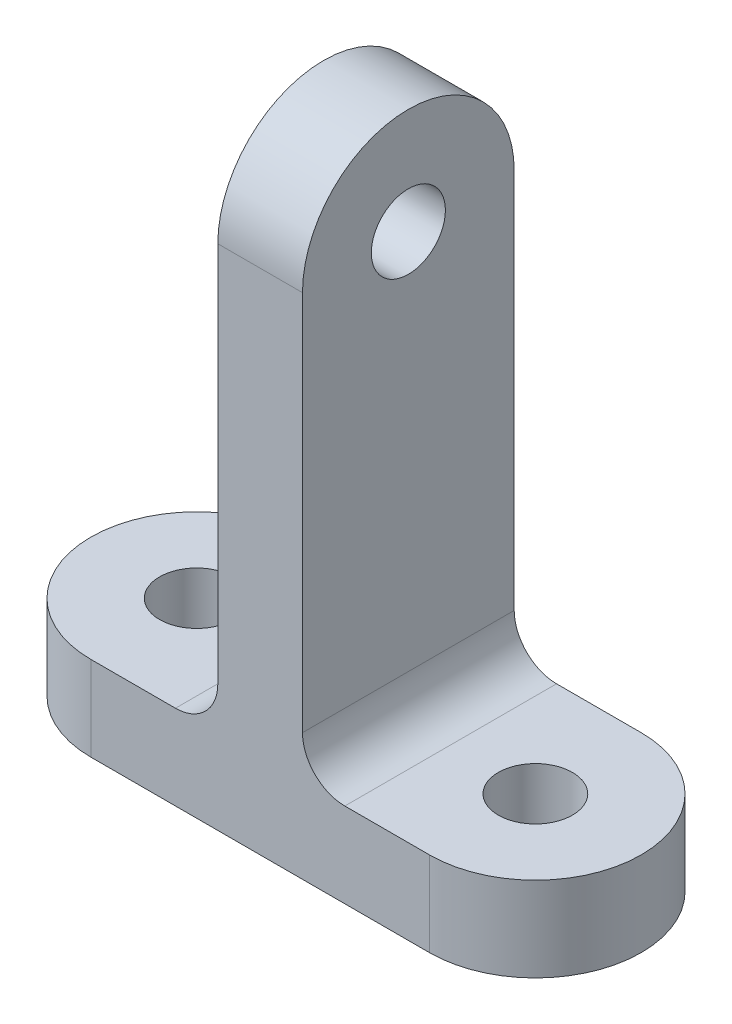
ISO-10303-21;
HEADER;
FILE_DESCRIPTION(('STEP AP214'),'2;1');
FILE_NAME('part.step','',(''),(''),'','','');
FILE_SCHEMA(('AUTOMOTIVE_DESIGN { 1 0 10303 214 1 1 1 1 }'));
ENDSEC;
DATA;
#1=APPLICATION_CONTEXT('core data for automotive mechanical design processes');
#2=APPLICATION_PROTOCOL_DEFINITION('international standard','automotive_design',2000,#1);
#3=PRODUCT_CONTEXT('',#1,'mechanical');
#4=PRODUCT('Part','Part','',(#3));
#5=PRODUCT_RELATED_PRODUCT_CATEGORY('part','',(#4));
#6=PRODUCT_DEFINITION_FORMATION('','',#4);
#7=PRODUCT_DEFINITION_CONTEXT('part definition',#1,'design');
#8=PRODUCT_DEFINITION('design','',#6,#7);
#9=PRODUCT_DEFINITION_SHAPE('','',#8);
#10=(LENGTH_UNIT() NAMED_UNIT(*) SI_UNIT(.MILLI.,.METRE.));
#11=(NAMED_UNIT(*) PLANE_ANGLE_UNIT() SI_UNIT($,.RADIAN.));
#12=(NAMED_UNIT(*) SI_UNIT($,.STERADIAN.) SOLID_ANGLE_UNIT());
#13=UNCERTAINTY_MEASURE_WITH_UNIT(LENGTH_MEASURE(1.E-05),#10,'distance_accuracy_value','');
#14=(GEOMETRIC_REPRESENTATION_CONTEXT(3) GLOBAL_UNCERTAINTY_ASSIGNED_CONTEXT((#13)) GLOBAL_UNIT_ASSIGNED_CONTEXT((#10,
#11,#12)) REPRESENTATION_CONTEXT('',''));
#15=CARTESIAN_POINT('',(0.,0.,0.));
#16=DIRECTION('',(0.,0.,1.));
#17=DIRECTION('',(1.,0.,0.));
#18=AXIS2_PLACEMENT_3D('',#15,#16,#17);
#19=CARTESIAN_POINT('',(-2.,29.,-5.));
#20=DIRECTION('',(1.,0.,0.));
#21=DIRECTION('',(0.,0.,-1.));
#22=AXIS2_PLACEMENT_3D('',#19,#20,#21);
#23=PLANE('',#22);
#24=CARTESIAN_POINT('',(-2.,24.,0.));
#25=DIRECTION('',(1.,0.,0.));
#26=DIRECTION('',(0.,0.,-1.));
#27=AXIS2_PLACEMENT_3D('',#24,#25,#26);
#28=CIRCLE('',#27,1.75);
#29=CARTESIAN_POINT('',(-2.,24.,-1.75));
#30=VERTEX_POINT('',#29);
#31=EDGE_CURVE('E153',#30,#30,#28,.F.);
#32=ORIENTED_EDGE('',*,*,#31,.F.);
#33=EDGE_LOOP('',(#32));
#34=FACE_BOUND('',#33,.T.);
#35=DIRECTION('',(0.,-1.,0.));
#36=VECTOR('',#35,1.);
#37=CARTESIAN_POINT('',(-2.,29.,-5.));
#38=LINE('',#37,#36);
#39=CARTESIAN_POINT('',(-2.,24.,-5.));
#40=VERTEX_POINT('',#39);
#41=CARTESIAN_POINT('',(-2.,6.,-5.));
#42=VERTEX_POINT('',#41);
#43=EDGE_CURVE('E152',#40,#42,#38,.T.);
#44=ORIENTED_EDGE('',*,*,#43,.T.);
#45=DIRECTION('',(0.,0.,1.));
#46=VECTOR('',#45,1.);
#47=CARTESIAN_POINT('',(-2.,6.,-5.));
#48=LINE('',#47,#46);
#49=CARTESIAN_POINT('',(-2.,6.,5.));
#50=VERTEX_POINT('',#49);
#51=EDGE_CURVE('E220',#42,#50,#48,.T.);
#52=ORIENTED_EDGE('',*,*,#51,.T.);
#53=DIRECTION('',(0.,-1.,0.));
#54=VECTOR('',#53,1.);
#55=CARTESIAN_POINT('',(-2.,29.,5.));
#56=LINE('',#55,#54);
#57=CARTESIAN_POINT('',(-2.,24.,5.));
#58=VERTEX_POINT('',#57);
#59=EDGE_CURVE('E161',#58,#50,#56,.T.);
#60=ORIENTED_EDGE('',*,*,#59,.F.);
#61=CARTESIAN_POINT('',(-2.,24.,0.));
#62=DIRECTION('',(1.,0.,0.));
#63=DIRECTION('',(0.,0.,-1.));
#64=AXIS2_PLACEMENT_3D('',#61,#62,#63);
#65=CIRCLE('',#64,5.);
#66=EDGE_CURVE('E163',#58,#40,#65,.F.);
#67=ORIENTED_EDGE('',*,*,#66,.T.);
#68=EDGE_LOOP('',(#44,#52,#60,#67));
#69=FACE_BOUND('',#68,.T.);
#70=ADVANCED_FACE('F59',(#34,#69),#23,.F.);
#71=CARTESIAN_POINT('',(2.,29.,-5.));
#72=DIRECTION('',(-1.,0.,0.));
#73=DIRECTION('',(0.,0.,1.));
#74=AXIS2_PLACEMENT_3D('',#71,#72,#73);
#75=PLANE('',#74);
#76=CARTESIAN_POINT('',(2.,24.,0.));
#77=DIRECTION('',(1.,0.,0.));
#78=DIRECTION('',(0.,0.,-1.));
#79=AXIS2_PLACEMENT_3D('',#76,#77,#78);
#80=CIRCLE('',#79,1.75);
#81=CARTESIAN_POINT('',(2.,24.,-1.75));
#82=VERTEX_POINT('',#81);
#83=EDGE_CURVE('E233',#82,#82,#80,.T.);
#84=ORIENTED_EDGE('',*,*,#83,.F.);
#85=EDGE_LOOP('',(#84));
#86=FACE_BOUND('',#85,.T.);
#87=DIRECTION('',(0.,-1.,0.));
#88=VECTOR('',#87,1.);
#89=CARTESIAN_POINT('',(2.,29.,5.));
#90=LINE('',#89,#88);
#91=CARTESIAN_POINT('',(2.,24.,5.));
#92=VERTEX_POINT('',#91);
#93=CARTESIAN_POINT('',(2.,6.,5.));
#94=VERTEX_POINT('',#93);
#95=EDGE_CURVE('E159',#92,#94,#90,.T.);
#96=ORIENTED_EDGE('',*,*,#95,.T.);
#97=DIRECTION('',(0.,0.,-1.));
#98=VECTOR('',#97,1.);
#99=CARTESIAN_POINT('',(2.,6.,-5.));
#100=LINE('',#99,#98);
#101=CARTESIAN_POINT('',(2.,6.,-5.));
#102=VERTEX_POINT('',#101);
#103=EDGE_CURVE('E158',#94,#102,#100,.T.);
#104=ORIENTED_EDGE('',*,*,#103,.T.);
#105=DIRECTION('',(0.,-1.,0.));
#106=VECTOR('',#105,1.);
#107=CARTESIAN_POINT('',(2.,29.,-5.));
#108=LINE('',#107,#106);
#109=CARTESIAN_POINT('',(2.,24.,-5.));
#110=VERTEX_POINT('',#109);
#111=EDGE_CURVE('E150',#110,#102,#108,.T.);
#112=ORIENTED_EDGE('',*,*,#111,.F.);
#113=CARTESIAN_POINT('',(2.,24.,0.));
#114=DIRECTION('',(1.,0.,0.));
#115=DIRECTION('',(0.,0.,-1.));
#116=AXIS2_PLACEMENT_3D('',#113,#114,#115);
#117=CIRCLE('',#116,5.);
#118=EDGE_CURVE('E135',#110,#92,#117,.T.);
#119=ORIENTED_EDGE('',*,*,#118,.T.);
#120=EDGE_LOOP('',(#96,#104,#112,#119));
#121=FACE_BOUND('',#120,.T.);
#122=ADVANCED_FACE('F156',(#86,#121),#75,.F.);
#123=CARTESIAN_POINT('',(0.,4.,-5.));
#124=DIRECTION('',(0.,0.,-1.));
#125=DIRECTION('',(-1.,0.,0.));
#126=AXIS2_PLACEMENT_3D('',#123,#124,#125);
#127=PLANE('',#126);
#128=ORIENTED_EDGE('',*,*,#43,.F.);
#129=DIRECTION('',(1.,0.,0.));
#130=VECTOR('',#129,1.);
#131=CARTESIAN_POINT('',(-9.07106781186547,24.,-5.));
#132=LINE('',#131,#130);
#133=EDGE_CURVE('E138',#40,#110,#132,.T.);
#134=ORIENTED_EDGE('',*,*,#133,.T.);
#135=ORIENTED_EDGE('',*,*,#111,.T.);
#136=CARTESIAN_POINT('',(4.,6.,-5.));
#137=DIRECTION('',(0.,0.,-1.));
#138=DIRECTION('',(-1.,0.,0.));
#139=AXIS2_PLACEMENT_3D('',#136,#137,#138);
#140=CIRCLE('',#139,2.);
#141=CARTESIAN_POINT('',(4.,4.,-5.));
#142=VERTEX_POINT('',#141);
#143=EDGE_CURVE('E216',#102,#142,#140,.F.);
#144=ORIENTED_EDGE('',*,*,#143,.T.);
#145=DIRECTION('',(1.,0.,0.));
#146=VECTOR('',#145,1.);
#147=CARTESIAN_POINT('',(0.,4.,-5.));
#148=LINE('',#147,#146);
#149=CARTESIAN_POINT('',(8.,4.,-5.));
#150=VERTEX_POINT('',#149);
#151=EDGE_CURVE('E183',#142,#150,#148,.T.);
#152=ORIENTED_EDGE('',*,*,#151,.T.);
#153=DIRECTION('',(0.,-1.,0.));
#154=VECTOR('',#153,1.);
#155=CARTESIAN_POINT('',(8.,4.,-5.));
#156=LINE('',#155,#154);
#157=CARTESIAN_POINT('',(8.,0.,-5.));
#158=VERTEX_POINT('',#157);
#159=EDGE_CURVE('E207',#150,#158,#156,.T.);
#160=ORIENTED_EDGE('',*,*,#159,.T.);
#161=DIRECTION('',(1.,0.,0.));
#162=VECTOR('',#161,1.);
#163=CARTESIAN_POINT('',(0.,0.,-5.));
#164=LINE('',#163,#162);
#165=CARTESIAN_POINT('',(-8.,0.,-5.));
#166=VERTEX_POINT('',#165);
#167=EDGE_CURVE('E201',#166,#158,#164,.T.);
#168=ORIENTED_EDGE('',*,*,#167,.F.);
#169=DIRECTION('',(0.,-1.,0.));
#170=VECTOR('',#169,1.);
#171=CARTESIAN_POINT('',(-8.,4.,-5.));
#172=LINE('',#171,#170);
#173=CARTESIAN_POINT('',(-8.,4.,-5.));
#174=VERTEX_POINT('',#173);
#175=EDGE_CURVE('E189',#174,#166,#172,.T.);
#176=ORIENTED_EDGE('',*,*,#175,.F.);
#177=CARTESIAN_POINT('',(-4.,4.,-5.));
#178=VERTEX_POINT('',#177);
#179=EDGE_CURVE('E184',#174,#178,#148,.T.);
#180=ORIENTED_EDGE('',*,*,#179,.T.);
#181=CARTESIAN_POINT('',(-4.,6.,-5.));
#182=DIRECTION('',(0.,0.,-1.));
#183=DIRECTION('',(-1.,0.,0.));
#184=AXIS2_PLACEMENT_3D('',#181,#182,#183);
#185=CIRCLE('',#184,2.);
#186=EDGE_CURVE('E12',#178,#42,#185,.F.);
#187=ORIENTED_EDGE('',*,*,#186,.T.);
#188=EDGE_LOOP('',(#128,#134,#135,#144,#152,#160,#168,#176,#180,#187));
#189=FACE_BOUND('',#188,.T.);
#190=ADVANCED_FACE('F149',(#189),#127,.T.);
#191=CARTESIAN_POINT('',(0.,4.,0.));
#192=DIRECTION('',(0.,1.,0.));
#193=DIRECTION('',(0.,0.,1.));
#194=AXIS2_PLACEMENT_3D('',#191,#192,#193);
#195=PLANE('',#194);
#196=DIRECTION('',(-1.,0.,0.));
#197=VECTOR('',#196,1.);
#198=CARTESIAN_POINT('',(0.,4.,5.));
#199=LINE('',#198,#197);
#200=CARTESIAN_POINT('',(-4.,4.,5.));
#201=VERTEX_POINT('',#200);
#202=CARTESIAN_POINT('',(-8.,4.,5.));
#203=VERTEX_POINT('',#202);
#204=EDGE_CURVE('E176',#201,#203,#199,.T.);
#205=ORIENTED_EDGE('',*,*,#204,.F.);
#206=DIRECTION('',(0.,0.,1.));
#207=VECTOR('',#206,1.);
#208=CARTESIAN_POINT('',(-4.,4.,0.));
#209=LINE('',#208,#207);
#210=EDGE_CURVE('E80',#201,#178,#209,.F.);
#211=ORIENTED_EDGE('',*,*,#210,.T.);
#212=ORIENTED_EDGE('',*,*,#179,.F.);
#213=CARTESIAN_POINT('',(-8.,4.,0.));
#214=DIRECTION('',(0.,1.,0.));
#215=DIRECTION('',(0.,0.,1.));
#216=AXIS2_PLACEMENT_3D('',#213,#214,#215);
#217=CIRCLE('',#216,5.);
#218=EDGE_CURVE('E172',#174,#203,#217,.T.);
#219=ORIENTED_EDGE('',*,*,#218,.T.);
#220=EDGE_LOOP('',(#205,#211,#212,#219));
#221=FACE_BOUND('',#220,.T.);
#222=CARTESIAN_POINT('',(-8.,4.,0.));
#223=DIRECTION('',(0.,1.,0.));
#224=DIRECTION('',(0.,0.,1.));
#225=AXIS2_PLACEMENT_3D('',#222,#223,#224);
#226=CIRCLE('',#225,1.75);
#227=CARTESIAN_POINT('',(-8.,4.,1.75));
#228=VERTEX_POINT('',#227);
#229=EDGE_CURVE('E169',#228,#228,#226,.T.);
#230=ORIENTED_EDGE('',*,*,#229,.F.);
#231=EDGE_LOOP('',(#230));
#232=FACE_BOUND('',#231,.T.);
#233=ADVANCED_FACE('F245',(#221,#232),#195,.T.);
#234=CARTESIAN_POINT('',(-8.,4.,0.));
#235=DIRECTION('',(0.,-1.,0.));
#236=DIRECTION('',(0.,0.,-1.));
#237=AXIS2_PLACEMENT_3D('',#234,#235,#236);
#238=CYLINDRICAL_SURFACE('',#237,5.);
#239=CARTESIAN_POINT('',(-8.,0.,0.));
#240=DIRECTION('',(0.,1.,0.));
#241=DIRECTION('',(0.,0.,1.));
#242=AXIS2_PLACEMENT_3D('',#239,#240,#241);
#243=CIRCLE('',#242,5.);
#244=CARTESIAN_POINT('',(-8.,0.,5.));
#245=VERTEX_POINT('',#244);
#246=EDGE_CURVE('E192',#166,#245,#243,.T.);
#247=ORIENTED_EDGE('',*,*,#246,.T.);
#248=DIRECTION('',(0.,-1.,0.));
#249=VECTOR('',#248,1.);
#250=CARTESIAN_POINT('',(-8.,4.,5.));
#251=LINE('',#250,#249);
#252=EDGE_CURVE('E211',#203,#245,#251,.T.);
#253=ORIENTED_EDGE('',*,*,#252,.F.);
#254=ORIENTED_EDGE('',*,*,#218,.F.);
#255=ORIENTED_EDGE('',*,*,#175,.T.);
#256=EDGE_LOOP('',(#247,#253,#254,#255));
#257=FACE_BOUND('',#256,.T.);
#258=ADVANCED_FACE('F271',(#257),#238,.T.);
#259=CARTESIAN_POINT('',(0.,4.,5.));
#260=DIRECTION('',(0.,0.,1.));
#261=DIRECTION('',(1.,0.,0.));
#262=AXIS2_PLACEMENT_3D('',#259,#260,#261);
#263=PLANE('',#262);
#264=DIRECTION('',(1.,0.,0.));
#265=VECTOR('',#264,1.);
#266=CARTESIAN_POINT('',(-9.07106781186547,24.,5.));
#267=LINE('',#266,#265);
#268=EDGE_CURVE('E141',#58,#92,#267,.T.);
#269=ORIENTED_EDGE('',*,*,#268,.F.);
#270=ORIENTED_EDGE('',*,*,#59,.T.);
#271=CARTESIAN_POINT('',(-4.,6.,5.));
#272=DIRECTION('',(0.,0.,1.));
#273=DIRECTION('',(1.,0.,0.));
#274=AXIS2_PLACEMENT_3D('',#271,#272,#273);
#275=CIRCLE('',#274,2.);
#276=EDGE_CURVE('E67',#50,#201,#275,.F.);
#277=ORIENTED_EDGE('',*,*,#276,.T.);
#278=ORIENTED_EDGE('',*,*,#204,.T.);
#279=ORIENTED_EDGE('',*,*,#252,.T.);
#280=DIRECTION('',(-1.,0.,0.));
#281=VECTOR('',#280,1.);
#282=CARTESIAN_POINT('',(0.,0.,5.));
#283=LINE('',#282,#281);
#284=CARTESIAN_POINT('',(8.,0.,5.));
#285=VERTEX_POINT('',#284);
#286=EDGE_CURVE('E195',#285,#245,#283,.T.);
#287=ORIENTED_EDGE('',*,*,#286,.F.);
#288=DIRECTION('',(0.,-1.,0.));
#289=VECTOR('',#288,1.);
#290=CARTESIAN_POINT('',(8.,4.,5.));
#291=LINE('',#290,#289);
#292=CARTESIAN_POINT('',(8.,4.,5.));
#293=VERTEX_POINT('',#292);
#294=EDGE_CURVE('E209',#293,#285,#291,.T.);
#295=ORIENTED_EDGE('',*,*,#294,.F.);
#296=CARTESIAN_POINT('',(4.,4.,5.));
#297=VERTEX_POINT('',#296);
#298=EDGE_CURVE('E177',#293,#297,#199,.T.);
#299=ORIENTED_EDGE('',*,*,#298,.T.);
#300=CARTESIAN_POINT('',(4.,6.,5.));
#301=DIRECTION('',(0.,0.,1.));
#302=DIRECTION('',(1.,0.,0.));
#303=AXIS2_PLACEMENT_3D('',#300,#301,#302);
#304=CIRCLE('',#303,2.);
#305=EDGE_CURVE('E218',#297,#94,#304,.F.);
#306=ORIENTED_EDGE('',*,*,#305,.T.);
#307=ORIENTED_EDGE('',*,*,#95,.F.);
#308=EDGE_LOOP('',(#269,#270,#277,#278,#279,#287,#295,#299,#306,#307));
#309=FACE_BOUND('',#308,.T.);
#310=ADVANCED_FACE('F228',(#309),#263,.T.);
#311=CARTESIAN_POINT('',(8.,4.,0.));
#312=DIRECTION('',(0.,-1.,0.));
#313=DIRECTION('',(0.,0.,-1.));
#314=AXIS2_PLACEMENT_3D('',#311,#312,#313);
#315=CYLINDRICAL_SURFACE('',#314,5.);
#316=CARTESIAN_POINT('',(8.,0.,0.));
#317=DIRECTION('',(0.,1.,0.));
#318=DIRECTION('',(0.,0.,1.));
#319=AXIS2_PLACEMENT_3D('',#316,#317,#318);
#320=CIRCLE('',#319,5.);
#321=EDGE_CURVE('E198',#285,#158,#320,.T.);
#322=ORIENTED_EDGE('',*,*,#321,.T.);
#323=ORIENTED_EDGE('',*,*,#159,.F.);
#324=CARTESIAN_POINT('',(8.,4.,0.));
#325=DIRECTION('',(0.,1.,0.));
#326=DIRECTION('',(0.,0.,1.));
#327=AXIS2_PLACEMENT_3D('',#324,#325,#326);
#328=CIRCLE('',#327,5.);
#329=EDGE_CURVE('E180',#293,#150,#328,.T.);
#330=ORIENTED_EDGE('',*,*,#329,.F.);
#331=ORIENTED_EDGE('',*,*,#294,.T.);
#332=EDGE_LOOP('',(#322,#323,#330,#331));
#333=FACE_BOUND('',#332,.T.);
#334=ADVANCED_FACE('F265',(#333),#315,.T.);
#335=CARTESIAN_POINT('',(-8.,4.,0.));
#336=DIRECTION('',(0.,-1.,0.));
#337=DIRECTION('',(0.,0.,-1.));
#338=AXIS2_PLACEMENT_3D('',#335,#336,#337);
#339=CYLINDRICAL_SURFACE('',#338,1.75);
#340=ORIENTED_EDGE('',*,*,#229,.T.);
#341=EDGE_LOOP('',(#340));
#342=FACE_BOUND('',#341,.T.);
#343=CARTESIAN_POINT('',(-8.,0.,0.));
#344=DIRECTION('',(0.,1.,0.));
#345=DIRECTION('',(0.,0.,1.));
#346=AXIS2_PLACEMENT_3D('',#343,#344,#345);
#347=CIRCLE('',#346,1.75);
#348=CARTESIAN_POINT('',(-8.,0.,1.75));
#349=VERTEX_POINT('',#348);
#350=EDGE_CURVE('E168',#349,#349,#347,.T.);
#351=ORIENTED_EDGE('',*,*,#350,.F.);
#352=EDGE_LOOP('',(#351));
#353=FACE_BOUND('',#352,.T.);
#354=ADVANCED_FACE('F262',(#342,#353),#339,.F.);
#355=CARTESIAN_POINT('',(8.,4.,0.));
#356=DIRECTION('',(0.,-1.,0.));
#357=DIRECTION('',(0.,0.,-1.));
#358=AXIS2_PLACEMENT_3D('',#355,#356,#357);
#359=CYLINDRICAL_SURFACE('',#358,1.75);
#360=CARTESIAN_POINT('',(8.,4.,0.));
#361=DIRECTION('',(0.,1.,0.));
#362=DIRECTION('',(0.,0.,1.));
#363=AXIS2_PLACEMENT_3D('',#360,#361,#362);
#364=CIRCLE('',#363,1.75);
#365=CARTESIAN_POINT('',(8.,4.,1.75));
#366=VERTEX_POINT('',#365);
#367=EDGE_CURVE('E186',#366,#366,#364,.T.);
#368=ORIENTED_EDGE('',*,*,#367,.T.);
#369=EDGE_LOOP('',(#368));
#370=FACE_BOUND('',#369,.T.);
#371=CARTESIAN_POINT('',(8.,0.,0.));
#372=DIRECTION('',(0.,1.,0.));
#373=DIRECTION('',(0.,0.,1.));
#374=AXIS2_PLACEMENT_3D('',#371,#372,#373);
#375=CIRCLE('',#374,1.75);
#376=CARTESIAN_POINT('',(8.,0.,1.75));
#377=VERTEX_POINT('',#376);
#378=EDGE_CURVE('E173',#377,#377,#375,.T.);
#379=ORIENTED_EDGE('',*,*,#378,.F.);
#380=EDGE_LOOP('',(#379));
#381=FACE_BOUND('',#380,.T.);
#382=ADVANCED_FACE('F256',(#370,#381),#359,.F.);
#383=ORIENTED_EDGE('',*,*,#151,.F.);
#384=DIRECTION('',(0.,0.,-1.));
#385=VECTOR('',#384,1.);
#386=CARTESIAN_POINT('',(4.,4.,0.));
#387=LINE('',#386,#385);
#388=EDGE_CURVE('E214',#142,#297,#387,.F.);
#389=ORIENTED_EDGE('',*,*,#388,.T.);
#390=ORIENTED_EDGE('',*,*,#298,.F.);
#391=ORIENTED_EDGE('',*,*,#329,.T.);
#392=EDGE_LOOP('',(#383,#389,#390,#391));
#393=FACE_BOUND('',#392,.T.);
#394=ORIENTED_EDGE('',*,*,#367,.F.);
#395=EDGE_LOOP('',(#394));
#396=FACE_BOUND('',#395,.T.);
#397=ADVANCED_FACE('F252',(#393,#396),#195,.T.);
#398=CARTESIAN_POINT('',(0.,0.,0.));
#399=DIRECTION('',(0.,1.,0.));
#400=DIRECTION('',(0.,0.,1.));
#401=AXIS2_PLACEMENT_3D('',#398,#399,#400);
#402=PLANE('',#401);
#403=ORIENTED_EDGE('',*,*,#350,.T.);
#404=EDGE_LOOP('',(#403));
#405=FACE_BOUND('',#404,.T.);
#406=ORIENTED_EDGE('',*,*,#246,.F.);
#407=ORIENTED_EDGE('',*,*,#167,.T.);
#408=ORIENTED_EDGE('',*,*,#321,.F.);
#409=ORIENTED_EDGE('',*,*,#286,.T.);
#410=EDGE_LOOP('',(#406,#407,#408,#409));
#411=FACE_BOUND('',#410,.T.);
#412=ORIENTED_EDGE('',*,*,#378,.T.);
#413=EDGE_LOOP('',(#412));
#414=FACE_BOUND('',#413,.T.);
#415=ADVANCED_FACE('F255',(#405,#411,#414),#402,.F.);
#416=CARTESIAN_POINT('',(-9.07106781186547,24.,0.));
#417=DIRECTION('',(1.,0.,0.));
#418=DIRECTION('',(0.,0.,-1.));
#419=AXIS2_PLACEMENT_3D('',#416,#417,#418);
#420=CYLINDRICAL_SURFACE('',#419,5.);
#421=ORIENTED_EDGE('',*,*,#268,.T.);
#422=ORIENTED_EDGE('',*,*,#118,.F.);
#423=ORIENTED_EDGE('',*,*,#133,.F.);
#424=ORIENTED_EDGE('',*,*,#66,.F.);
#425=EDGE_LOOP('',(#421,#422,#423,#424));
#426=FACE_BOUND('',#425,.T.);
#427=ADVANCED_FACE('F137',(#426),#420,.T.);
#428=CARTESIAN_POINT('',(-9.07106781186547,24.,0.));
#429=DIRECTION('',(1.,0.,0.));
#430=DIRECTION('',(0.,0.,-1.));
#431=AXIS2_PLACEMENT_3D('',#428,#429,#430);
#432=CYLINDRICAL_SURFACE('',#431,1.75);
#433=ORIENTED_EDGE('',*,*,#31,.T.);
#434=EDGE_LOOP('',(#433));
#435=FACE_BOUND('',#434,.T.);
#436=ORIENTED_EDGE('',*,*,#83,.T.);
#437=EDGE_LOOP('',(#436));
#438=FACE_BOUND('',#437,.T.);
#439=ADVANCED_FACE('F237',(#435,#438),#432,.F.);
#440=CARTESIAN_POINT('',(4.,6.,-5.));
#441=DIRECTION('',(0.,0.,-1.));
#442=DIRECTION('',(-1.,0.,0.));
#443=AXIS2_PLACEMENT_3D('',#440,#441,#442);
#444=CYLINDRICAL_SURFACE('',#443,2.);
#445=ORIENTED_EDGE('',*,*,#305,.F.);
#446=ORIENTED_EDGE('',*,*,#388,.F.);
#447=ORIENTED_EDGE('',*,*,#143,.F.);
#448=ORIENTED_EDGE('',*,*,#103,.F.);
#449=EDGE_LOOP('',(#445,#446,#447,#448));
#450=FACE_BOUND('',#449,.T.);
#451=ADVANCED_FACE('F277',(#450),#444,.F.);
#452=CARTESIAN_POINT('',(-4.,6.,-5.));
#453=DIRECTION('',(0.,0.,1.));
#454=DIRECTION('',(1.,0.,0.));
#455=AXIS2_PLACEMENT_3D('',#452,#453,#454);
#456=CYLINDRICAL_SURFACE('',#455,2.);
#457=ORIENTED_EDGE('',*,*,#186,.F.);
#458=ORIENTED_EDGE('',*,*,#210,.F.);
#459=ORIENTED_EDGE('',*,*,#276,.F.);
#460=ORIENTED_EDGE('',*,*,#51,.F.);
#461=EDGE_LOOP('',(#457,#458,#459,#460));
#462=FACE_BOUND('',#461,.T.);
#463=ADVANCED_FACE('F61',(#462),#456,.F.);
#464=CLOSED_SHELL('',(#70,#122,#190,#233,#258,#310,#334,#354,#382,#397,#415,#427,#439,#451,#463));
#465=MANIFOLD_SOLID_BREP('B2',#464);
#466=ADVANCED_BREP_SHAPE_REPRESENTATION('',(#18,#465),#14);
#467=SHAPE_DEFINITION_REPRESENTATION(#9,#466);
ENDSEC;
END-ISO-10303-21;
